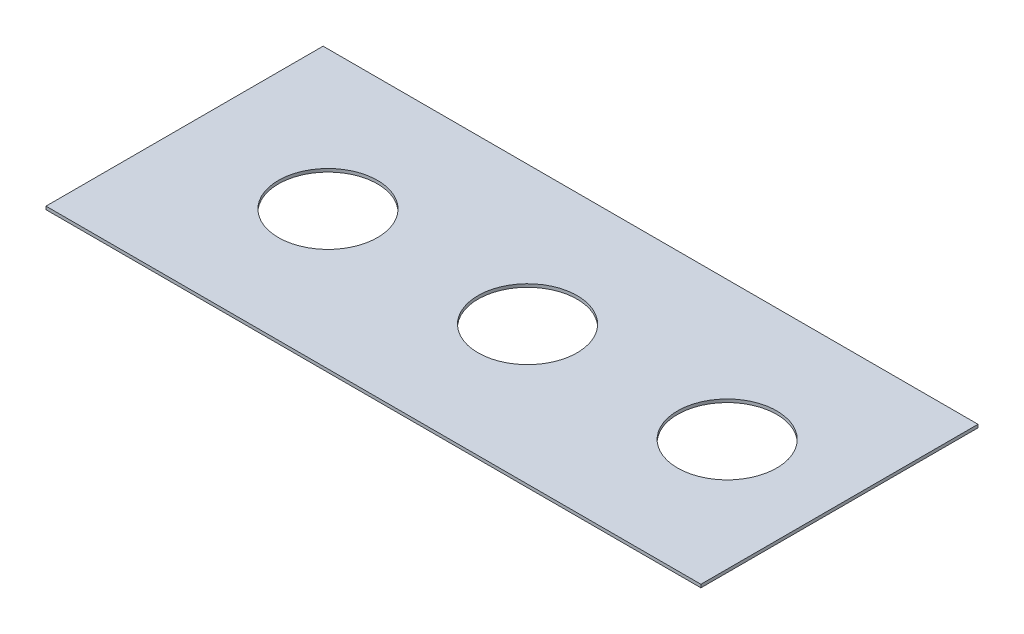
ISO-10303-21;
HEADER;
FILE_DESCRIPTION(('STEP AP214'),'2;1');
FILE_NAME('part.step','',(''),(''),'','','');
FILE_SCHEMA(('AUTOMOTIVE_DESIGN { 1 0 10303 214 1 1 1 1 }'));
ENDSEC;
DATA;
#1=APPLICATION_CONTEXT('core data for automotive mechanical design processes');
#2=APPLICATION_PROTOCOL_DEFINITION('international standard','automotive_design',2000,#1);
#3=PRODUCT_CONTEXT('',#1,'mechanical');
#4=PRODUCT('Part','Part','',(#3));
#5=PRODUCT_RELATED_PRODUCT_CATEGORY('part','',(#4));
#6=PRODUCT_DEFINITION_FORMATION('','',#4);
#7=PRODUCT_DEFINITION_CONTEXT('part definition',#1,'design');
#8=PRODUCT_DEFINITION('design','',#6,#7);
#9=PRODUCT_DEFINITION_SHAPE('','',#8);
#10=(LENGTH_UNIT() NAMED_UNIT(*) SI_UNIT(.MILLI.,.METRE.));
#11=(NAMED_UNIT(*) PLANE_ANGLE_UNIT() SI_UNIT($,.RADIAN.));
#12=(NAMED_UNIT(*) SI_UNIT($,.STERADIAN.) SOLID_ANGLE_UNIT());
#13=UNCERTAINTY_MEASURE_WITH_UNIT(LENGTH_MEASURE(1.E-05),#10,'distance_accuracy_value','');
#14=(GEOMETRIC_REPRESENTATION_CONTEXT(3) GLOBAL_UNCERTAINTY_ASSIGNED_CONTEXT((#13)) GLOBAL_UNIT_ASSIGNED_CONTEXT((#10,
#11,#12)) REPRESENTATION_CONTEXT('',''));
#15=CARTESIAN_POINT('',(0.,0.,0.));
#16=DIRECTION('',(0.,0.,1.));
#17=DIRECTION('',(1.,0.,0.));
#18=AXIS2_PLACEMENT_3D('',#15,#16,#17);
#19=CARTESIAN_POINT('',(0.,1.5748,0.));
#20=DIRECTION('',(0.,-1.,0.));
#21=DIRECTION('',(0.,0.,-1.));
#22=AXIS2_PLACEMENT_3D('',#19,#20,#21);
#23=PLANE('',#22);
#24=DIRECTION('',(0.,0.,-1.));
#25=VECTOR('',#24,1.);
#26=CARTESIAN_POINT('',(165.1,1.5748,69.85));
#27=LINE('',#26,#25);
#28=CARTESIAN_POINT('',(165.1,1.5748,69.85));
#29=VERTEX_POINT('',#28);
#30=CARTESIAN_POINT('',(165.1,1.5748,-69.85));
#31=VERTEX_POINT('',#30);
#32=EDGE_CURVE('E84',#29,#31,#27,.T.);
#33=ORIENTED_EDGE('',*,*,#32,.T.);
#34=DIRECTION('',(-1.,0.,0.));
#35=VECTOR('',#34,1.);
#36=CARTESIAN_POINT('',(-165.1,1.5748,-69.85));
#37=LINE('',#36,#35);
#38=CARTESIAN_POINT('',(-165.1,1.5748,-69.85));
#39=VERTEX_POINT('',#38);
#40=EDGE_CURVE('E79',#31,#39,#37,.T.);
#41=ORIENTED_EDGE('',*,*,#40,.T.);
#42=DIRECTION('',(0.,0.,1.));
#43=VECTOR('',#42,1.);
#44=CARTESIAN_POINT('',(-165.1,1.5748,69.85));
#45=LINE('',#44,#43);
#46=CARTESIAN_POINT('',(-165.1,1.5748,69.85));
#47=VERTEX_POINT('',#46);
#48=EDGE_CURVE('E82',#39,#47,#45,.T.);
#49=ORIENTED_EDGE('',*,*,#48,.T.);
#50=DIRECTION('',(1.,0.,0.));
#51=VECTOR('',#50,1.);
#52=CARTESIAN_POINT('',(-165.1,1.5748,69.85));
#53=LINE('',#52,#51);
#54=EDGE_CURVE('E49',#47,#29,#53,.T.);
#55=ORIENTED_EDGE('',*,*,#54,.T.);
#56=EDGE_LOOP('',(#33,#41,#49,#55));
#57=FACE_BOUND('',#56,.T.);
#58=CARTESIAN_POINT('',(-92.7862000000001,1.5748,0.));
#59=DIRECTION('',(0.,1.,0.));
#60=DIRECTION('',(0.,0.,1.));
#61=AXIS2_PLACEMENT_3D('',#58,#59,#60);
#62=CIRCLE('',#61,24.9936);
#63=CARTESIAN_POINT('',(-92.7862000000001,1.5748,24.9936));
#64=VERTEX_POINT('',#63);
#65=EDGE_CURVE('E99',#64,#64,#62,.T.);
#66=ORIENTED_EDGE('',*,*,#65,.F.);
#67=EDGE_LOOP('',(#66));
#68=FACE_BOUND('',#67,.T.);
#69=CARTESIAN_POINT('',(7.84859999999996,1.5748,0.));
#70=DIRECTION('',(0.,1.,0.));
#71=DIRECTION('',(0.,0.,1.));
#72=AXIS2_PLACEMENT_3D('',#69,#70,#71);
#73=CIRCLE('',#72,24.9936);
#74=CARTESIAN_POINT('',(7.84859999999996,1.5748,24.9936));
#75=VERTEX_POINT('',#74);
#76=EDGE_CURVE('E114',#75,#75,#73,.T.);
#77=ORIENTED_EDGE('',*,*,#76,.F.);
#78=EDGE_LOOP('',(#77));
#79=FACE_BOUND('',#78,.T.);
#80=CARTESIAN_POINT('',(108.4834,1.5748,0.));
#81=DIRECTION('',(0.,1.,0.));
#82=DIRECTION('',(0.,0.,1.));
#83=AXIS2_PLACEMENT_3D('',#80,#81,#82);
#84=CIRCLE('',#83,24.9936);
#85=CARTESIAN_POINT('',(108.4834,1.5748,24.9936));
#86=VERTEX_POINT('',#85);
#87=EDGE_CURVE('E120',#86,#86,#84,.T.);
#88=ORIENTED_EDGE('',*,*,#87,.F.);
#89=EDGE_LOOP('',(#88));
#90=FACE_BOUND('',#89,.T.);
#91=ADVANCED_FACE('F32',(#57,#68,#79,#90),#23,.F.);
#92=CARTESIAN_POINT('',(0.,0.,0.));
#93=DIRECTION('',(0.,-1.,0.));
#94=DIRECTION('',(0.,0.,-1.));
#95=AXIS2_PLACEMENT_3D('',#92,#93,#94);
#96=PLANE('',#95);
#97=CARTESIAN_POINT('',(7.84859999999996,0.,0.));
#98=DIRECTION('',(0.,1.,0.));
#99=DIRECTION('',(0.,0.,1.));
#100=AXIS2_PLACEMENT_3D('',#97,#98,#99);
#101=CIRCLE('',#100,24.9936);
#102=CARTESIAN_POINT('',(7.84859999999996,0.,24.9936));
#103=VERTEX_POINT('',#102);
#104=EDGE_CURVE('E117',#103,#103,#101,.T.);
#105=ORIENTED_EDGE('',*,*,#104,.T.);
#106=EDGE_LOOP('',(#105));
#107=FACE_BOUND('',#106,.T.);
#108=DIRECTION('',(0.,0.,-1.));
#109=VECTOR('',#108,1.);
#110=CARTESIAN_POINT('',(165.1,0.,69.85));
#111=LINE('',#110,#109);
#112=CARTESIAN_POINT('',(165.1,0.,69.85));
#113=VERTEX_POINT('',#112);
#114=CARTESIAN_POINT('',(165.1,0.,-69.85));
#115=VERTEX_POINT('',#114);
#116=EDGE_CURVE('E96',#113,#115,#111,.T.);
#117=ORIENTED_EDGE('',*,*,#116,.F.);
#118=DIRECTION('',(1.,0.,0.));
#119=VECTOR('',#118,1.);
#120=CARTESIAN_POINT('',(-165.1,0.,69.85));
#121=LINE('',#120,#119);
#122=CARTESIAN_POINT('',(-165.1,0.,69.85));
#123=VERTEX_POINT('',#122);
#124=EDGE_CURVE('E72',#123,#113,#121,.T.);
#125=ORIENTED_EDGE('',*,*,#124,.F.);
#126=DIRECTION('',(0.,0.,1.));
#127=VECTOR('',#126,1.);
#128=CARTESIAN_POINT('',(-165.1,0.,69.85));
#129=LINE('',#128,#127);
#130=CARTESIAN_POINT('',(-165.1,0.,-69.85));
#131=VERTEX_POINT('',#130);
#132=EDGE_CURVE('E66',#131,#123,#129,.T.);
#133=ORIENTED_EDGE('',*,*,#132,.F.);
#134=DIRECTION('',(-1.,0.,0.));
#135=VECTOR('',#134,1.);
#136=CARTESIAN_POINT('',(-165.1,0.,-69.85));
#137=LINE('',#136,#135);
#138=EDGE_CURVE('E88',#115,#131,#137,.T.);
#139=ORIENTED_EDGE('',*,*,#138,.F.);
#140=EDGE_LOOP('',(#117,#125,#133,#139));
#141=FACE_BOUND('',#140,.T.);
#142=CARTESIAN_POINT('',(-92.7862000000001,0.,0.));
#143=DIRECTION('',(0.,1.,0.));
#144=DIRECTION('',(0.,0.,1.));
#145=AXIS2_PLACEMENT_3D('',#142,#143,#144);
#146=CIRCLE('',#145,24.9936);
#147=CARTESIAN_POINT('',(-92.7862000000001,0.,24.9936));
#148=VERTEX_POINT('',#147);
#149=EDGE_CURVE('E111',#148,#148,#146,.T.);
#150=ORIENTED_EDGE('',*,*,#149,.T.);
#151=EDGE_LOOP('',(#150));
#152=FACE_BOUND('',#151,.T.);
#153=CARTESIAN_POINT('',(108.4834,0.,0.));
#154=DIRECTION('',(0.,1.,0.));
#155=DIRECTION('',(0.,0.,1.));
#156=AXIS2_PLACEMENT_3D('',#153,#154,#155);
#157=CIRCLE('',#156,24.9936);
#158=CARTESIAN_POINT('',(108.4834,0.,24.9936));
#159=VERTEX_POINT('',#158);
#160=EDGE_CURVE('E123',#159,#159,#157,.T.);
#161=ORIENTED_EDGE('',*,*,#160,.T.);
#162=EDGE_LOOP('',(#161));
#163=FACE_BOUND('',#162,.T.);
#164=ADVANCED_FACE('F107',(#107,#141,#152,#163),#96,.T.);
#165=CARTESIAN_POINT('',(165.1,1.5748,69.85));
#166=DIRECTION('',(-1.,0.,0.));
#167=DIRECTION('',(0.,0.,1.));
#168=AXIS2_PLACEMENT_3D('',#165,#166,#167);
#169=PLANE('',#168);
#170=ORIENTED_EDGE('',*,*,#116,.T.);
#171=DIRECTION('',(0.,-1.,0.));
#172=VECTOR('',#171,1.);
#173=CARTESIAN_POINT('',(165.1,1.5748,-69.85));
#174=LINE('',#173,#172);
#175=EDGE_CURVE('E11',#31,#115,#174,.T.);
#176=ORIENTED_EDGE('',*,*,#175,.F.);
#177=ORIENTED_EDGE('',*,*,#32,.F.);
#178=DIRECTION('',(0.,-1.,0.));
#179=VECTOR('',#178,1.);
#180=CARTESIAN_POINT('',(165.1,1.5748,69.85));
#181=LINE('',#180,#179);
#182=EDGE_CURVE('E92',#29,#113,#181,.T.);
#183=ORIENTED_EDGE('',*,*,#182,.T.);
#184=EDGE_LOOP('',(#170,#176,#177,#183));
#185=FACE_BOUND('',#184,.T.);
#186=ADVANCED_FACE('F34',(#185),#169,.F.);
#187=CARTESIAN_POINT('',(-165.1,1.5748,-69.85));
#188=DIRECTION('',(0.,0.,1.));
#189=DIRECTION('',(1.,0.,0.));
#190=AXIS2_PLACEMENT_3D('',#187,#188,#189);
#191=PLANE('',#190);
#192=ORIENTED_EDGE('',*,*,#138,.T.);
#193=DIRECTION('',(0.,-1.,0.));
#194=VECTOR('',#193,1.);
#195=CARTESIAN_POINT('',(-165.1,1.5748,-69.85));
#196=LINE('',#195,#194);
#197=EDGE_CURVE('E41',#39,#131,#196,.T.);
#198=ORIENTED_EDGE('',*,*,#197,.F.);
#199=ORIENTED_EDGE('',*,*,#40,.F.);
#200=ORIENTED_EDGE('',*,*,#175,.T.);
#201=EDGE_LOOP('',(#192,#198,#199,#200));
#202=FACE_BOUND('',#201,.T.);
#203=ADVANCED_FACE('F87',(#202),#191,.F.);
#204=CARTESIAN_POINT('',(-165.1,1.5748,69.85));
#205=DIRECTION('',(1.,0.,0.));
#206=DIRECTION('',(0.,0.,-1.));
#207=AXIS2_PLACEMENT_3D('',#204,#205,#206);
#208=PLANE('',#207);
#209=ORIENTED_EDGE('',*,*,#132,.T.);
#210=DIRECTION('',(0.,-1.,0.));
#211=VECTOR('',#210,1.);
#212=CARTESIAN_POINT('',(-165.1,1.5748,69.85));
#213=LINE('',#212,#211);
#214=EDGE_CURVE('E89',#47,#123,#213,.T.);
#215=ORIENTED_EDGE('',*,*,#214,.F.);
#216=ORIENTED_EDGE('',*,*,#48,.F.);
#217=ORIENTED_EDGE('',*,*,#197,.T.);
#218=EDGE_LOOP('',(#209,#215,#216,#217));
#219=FACE_BOUND('',#218,.T.);
#220=ADVANCED_FACE('F90',(#219),#208,.F.);
#221=CARTESIAN_POINT('',(-165.1,1.5748,69.85));
#222=DIRECTION('',(0.,0.,-1.));
#223=DIRECTION('',(-1.,0.,0.));
#224=AXIS2_PLACEMENT_3D('',#221,#222,#223);
#225=PLANE('',#224);
#226=ORIENTED_EDGE('',*,*,#124,.T.);
#227=ORIENTED_EDGE('',*,*,#182,.F.);
#228=ORIENTED_EDGE('',*,*,#54,.F.);
#229=ORIENTED_EDGE('',*,*,#214,.T.);
#230=EDGE_LOOP('',(#226,#227,#228,#229));
#231=FACE_BOUND('',#230,.T.);
#232=ADVANCED_FACE('F104',(#231),#225,.F.);
#233=CARTESIAN_POINT('',(-92.7862000000001,1.5748,0.));
#234=DIRECTION('',(0.,-1.,0.));
#235=DIRECTION('',(0.,0.,-1.));
#236=AXIS2_PLACEMENT_3D('',#233,#234,#235);
#237=CYLINDRICAL_SURFACE('',#236,24.9936);
#238=ORIENTED_EDGE('',*,*,#65,.T.);
#239=EDGE_LOOP('',(#238));
#240=FACE_BOUND('',#239,.T.);
#241=ORIENTED_EDGE('',*,*,#149,.F.);
#242=EDGE_LOOP('',(#241));
#243=FACE_BOUND('',#242,.T.);
#244=ADVANCED_FACE('F140',(#240,#243),#237,.F.);
#245=CARTESIAN_POINT('',(7.84859999999996,1.5748,0.));
#246=DIRECTION('',(0.,-1.,0.));
#247=DIRECTION('',(0.,0.,-1.));
#248=AXIS2_PLACEMENT_3D('',#245,#246,#247);
#249=CYLINDRICAL_SURFACE('',#248,24.9936);
#250=ORIENTED_EDGE('',*,*,#76,.T.);
#251=EDGE_LOOP('',(#250));
#252=FACE_BOUND('',#251,.T.);
#253=ORIENTED_EDGE('',*,*,#104,.F.);
#254=EDGE_LOOP('',(#253));
#255=FACE_BOUND('',#254,.T.);
#256=ADVANCED_FACE('F186',(#252,#255),#249,.F.);
#257=CARTESIAN_POINT('',(108.4834,1.5748,0.));
#258=DIRECTION('',(0.,-1.,0.));
#259=DIRECTION('',(0.,0.,-1.));
#260=AXIS2_PLACEMENT_3D('',#257,#258,#259);
#261=CYLINDRICAL_SURFACE('',#260,24.9936);
#262=ORIENTED_EDGE('',*,*,#87,.T.);
#263=EDGE_LOOP('',(#262));
#264=FACE_BOUND('',#263,.T.);
#265=ORIENTED_EDGE('',*,*,#160,.F.);
#266=EDGE_LOOP('',(#265));
#267=FACE_BOUND('',#266,.T.);
#268=ADVANCED_FACE('F129',(#264,#267),#261,.F.);
#269=CLOSED_SHELL('',(#91,#164,#186,#203,#220,#232,#244,#256,#268));
#270=MANIFOLD_SOLID_BREP('B2',#269);
#271=ADVANCED_BREP_SHAPE_REPRESENTATION('',(#18,#270),#14);
#272=SHAPE_DEFINITION_REPRESENTATION(#9,#271);
ENDSEC;
END-ISO-10303-21;
